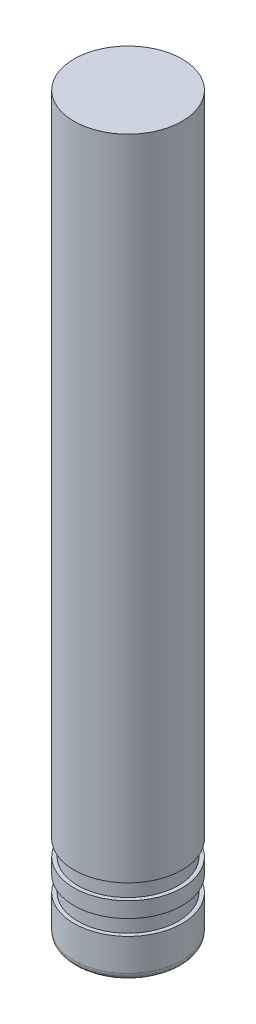
ISO-10303-21;
HEADER;
FILE_DESCRIPTION(('STEP AP214'),'2;1');
FILE_NAME('part.step','',(''),(''),'','','');
FILE_SCHEMA(('AUTOMOTIVE_DESIGN { 1 0 10303 214 1 1 1 1 }'));
ENDSEC;
DATA;
#1=APPLICATION_CONTEXT('core data for automotive mechanical design processes');
#2=APPLICATION_PROTOCOL_DEFINITION('international standard','automotive_design',2000,#1);
#3=PRODUCT_CONTEXT('',#1,'mechanical');
#4=PRODUCT('Part','Part','',(#3));
#5=PRODUCT_RELATED_PRODUCT_CATEGORY('part','',(#4));
#6=PRODUCT_DEFINITION_FORMATION('','',#4);
#7=PRODUCT_DEFINITION_CONTEXT('part definition',#1,'design');
#8=PRODUCT_DEFINITION('design','',#6,#7);
#9=PRODUCT_DEFINITION_SHAPE('','',#8);
#10=(LENGTH_UNIT() NAMED_UNIT(*) SI_UNIT(.MILLI.,.METRE.));
#11=(NAMED_UNIT(*) PLANE_ANGLE_UNIT() SI_UNIT($,.RADIAN.));
#12=(NAMED_UNIT(*) SI_UNIT($,.STERADIAN.) SOLID_ANGLE_UNIT());
#13=UNCERTAINTY_MEASURE_WITH_UNIT(LENGTH_MEASURE(1.E-05),#10,'distance_accuracy_value','');
#14=(GEOMETRIC_REPRESENTATION_CONTEXT(3) GLOBAL_UNCERTAINTY_ASSIGNED_CONTEXT((#13)) GLOBAL_UNIT_ASSIGNED_CONTEXT((#10,
#11,#12)) REPRESENTATION_CONTEXT('',''));
#15=CARTESIAN_POINT('',(0.,0.,0.));
#16=DIRECTION('',(0.,0.,1.));
#17=DIRECTION('',(1.,0.,0.));
#18=AXIS2_PLACEMENT_3D('',#15,#16,#17);
#19=CARTESIAN_POINT('',(20.,0.,7.));
#20=DIRECTION('',(0.,-1.,0.));
#21=DIRECTION('',(-1.,0.,0.));
#22=AXIS2_PLACEMENT_3D('',#19,#20,#21);
#23=PLANE('',#22);
#24=CARTESIAN_POINT('',(20.,0.,7.));
#25=DIRECTION('',(0.,-1.,0.));
#26=DIRECTION('',(1.,0.,0.));
#27=AXIS2_PLACEMENT_3D('',#24,#25,#26);
#28=CIRCLE('',#27,3.5);
#29=CARTESIAN_POINT('',(23.5,0.,7.));
#30=VERTEX_POINT('',#29);
#31=EDGE_CURVE('E27',#30,#30,#28,.T.);
#32=ORIENTED_EDGE('',*,*,#31,.F.);
#33=EDGE_LOOP('',(#32));
#34=FACE_BOUND('',#33,.T.);
#35=ADVANCED_FACE('F17',(#34),#23,.F.);
#36=CARTESIAN_POINT('',(20.,0.,7.));
#37=DIRECTION('',(0.,1.,0.));
#38=DIRECTION('',(1.,0.,0.));
#39=AXIS2_PLACEMENT_3D('',#36,#37,#38);
#40=CYLINDRICAL_SURFACE('',#39,3.5);
#41=ORIENTED_EDGE('',*,*,#31,.T.);
#42=DIRECTION('',(0.,-1.,0.));
#43=VECTOR('',#42,1.);
#44=CARTESIAN_POINT('',(23.5,0.,7.));
#45=LINE('',#44,#43);
#46=CARTESIAN_POINT('',(23.5,-42.,7.));
#47=VERTEX_POINT('',#46);
#48=EDGE_CURVE('E11',#30,#47,#45,.T.);
#49=ORIENTED_EDGE('',*,*,#48,.T.);
#50=CARTESIAN_POINT('',(20.,-42.,7.));
#51=DIRECTION('',(0.,-1.,0.));
#52=DIRECTION('',(1.,0.,0.));
#53=AXIS2_PLACEMENT_3D('',#50,#51,#52);
#54=CIRCLE('',#53,3.5);
#55=EDGE_CURVE('E76',#47,#47,#54,.T.);
#56=ORIENTED_EDGE('',*,*,#55,.F.);
#57=ORIENTED_EDGE('',*,*,#48,.F.);
#58=EDGE_LOOP('',(#41,#49,#56,#57));
#59=FACE_BOUND('',#58,.T.);
#60=ADVANCED_FACE('F225',(#59),#40,.T.);
#61=CARTESIAN_POINT('',(20.,-42.,7.));
#62=DIRECTION('',(0.,-1.,0.));
#63=DIRECTION('',(-1.,0.,0.));
#64=AXIS2_PLACEMENT_3D('',#61,#62,#63);
#65=PLANE('',#64);
#66=CARTESIAN_POINT('',(20.,-42.,7.));
#67=DIRECTION('',(0.,-1.,0.));
#68=DIRECTION('',(1.,0.,0.));
#69=AXIS2_PLACEMENT_3D('',#66,#67,#68);
#70=CIRCLE('',#69,3.25);
#71=CARTESIAN_POINT('',(23.25,-42.,7.));
#72=VERTEX_POINT('',#71);
#73=EDGE_CURVE('E70',#72,#72,#70,.T.);
#74=ORIENTED_EDGE('',*,*,#73,.F.);
#75=EDGE_LOOP('',(#74));
#76=FACE_BOUND('',#75,.T.);
#77=ORIENTED_EDGE('',*,*,#55,.T.);
#78=EDGE_LOOP('',(#77));
#79=FACE_BOUND('',#78,.T.);
#80=ADVANCED_FACE('F136',(#76,#79),#65,.T.);
#81=CARTESIAN_POINT('',(20.,-42.,7.));
#82=DIRECTION('',(0.,1.,0.));
#83=DIRECTION('',(1.,0.,0.));
#84=AXIS2_PLACEMENT_3D('',#81,#82,#83);
#85=CYLINDRICAL_SURFACE('',#84,3.25);
#86=DIRECTION('',(0.,-1.,0.));
#87=VECTOR('',#86,1.);
#88=CARTESIAN_POINT('',(23.25,-42.,7.));
#89=LINE('',#88,#87);
#90=CARTESIAN_POINT('',(23.25,-43.,7.));
#91=VERTEX_POINT('',#90);
#92=EDGE_CURVE('E73',#72,#91,#89,.T.);
#93=ORIENTED_EDGE('',*,*,#92,.T.);
#94=CARTESIAN_POINT('',(20.,-43.,7.));
#95=DIRECTION('',(0.,1.,0.));
#96=DIRECTION('',(1.,0.,0.));
#97=AXIS2_PLACEMENT_3D('',#94,#95,#96);
#98=CIRCLE('',#97,3.25);
#99=EDGE_CURVE('E85',#91,#91,#98,.T.);
#100=ORIENTED_EDGE('',*,*,#99,.T.);
#101=ORIENTED_EDGE('',*,*,#92,.F.);
#102=ORIENTED_EDGE('',*,*,#73,.T.);
#103=EDGE_LOOP('',(#93,#100,#101,#102));
#104=FACE_BOUND('',#103,.T.);
#105=ADVANCED_FACE('F71',(#104),#85,.T.);
#106=CARTESIAN_POINT('',(20.,-43.,7.));
#107=DIRECTION('',(0.,-1.,0.));
#108=DIRECTION('',(-1.,0.,0.));
#109=AXIS2_PLACEMENT_3D('',#106,#107,#108);
#110=PLANE('',#109);
#111=ORIENTED_EDGE('',*,*,#99,.F.);
#112=EDGE_LOOP('',(#111));
#113=FACE_BOUND('',#112,.T.);
#114=CARTESIAN_POINT('',(20.,-43.,7.));
#115=DIRECTION('',(0.,-1.,0.));
#116=DIRECTION('',(1.,0.,0.));
#117=AXIS2_PLACEMENT_3D('',#114,#115,#116);
#118=CIRCLE('',#117,3.5);
#119=CARTESIAN_POINT('',(23.5,-43.,7.));
#120=VERTEX_POINT('',#119);
#121=EDGE_CURVE('E162',#120,#120,#118,.T.);
#122=ORIENTED_EDGE('',*,*,#121,.F.);
#123=EDGE_LOOP('',(#122));
#124=FACE_BOUND('',#123,.T.);
#125=ADVANCED_FACE('F120',(#113,#124),#110,.F.);
#126=CARTESIAN_POINT('',(20.,-43.,7.));
#127=DIRECTION('',(0.,1.,0.));
#128=DIRECTION('',(1.,0.,0.));
#129=AXIS2_PLACEMENT_3D('',#126,#127,#128);
#130=CYLINDRICAL_SURFACE('',#129,3.5);
#131=ORIENTED_EDGE('',*,*,#121,.T.);
#132=DIRECTION('',(0.,-1.,0.));
#133=VECTOR('',#132,1.);
#134=CARTESIAN_POINT('',(23.5,-43.,7.));
#135=LINE('',#134,#133);
#136=CARTESIAN_POINT('',(23.5,-44.,7.));
#137=VERTEX_POINT('',#136);
#138=EDGE_CURVE('E172',#120,#137,#135,.T.);
#139=ORIENTED_EDGE('',*,*,#138,.T.);
#140=CARTESIAN_POINT('',(20.,-44.,7.));
#141=DIRECTION('',(0.,-1.,0.));
#142=DIRECTION('',(1.,0.,0.));
#143=AXIS2_PLACEMENT_3D('',#140,#141,#142);
#144=CIRCLE('',#143,3.5);
#145=EDGE_CURVE('E155',#137,#137,#144,.T.);
#146=ORIENTED_EDGE('',*,*,#145,.F.);
#147=ORIENTED_EDGE('',*,*,#138,.F.);
#148=EDGE_LOOP('',(#131,#139,#146,#147));
#149=FACE_BOUND('',#148,.T.);
#150=ADVANCED_FACE('F128',(#149),#130,.T.);
#151=CARTESIAN_POINT('',(20.,-48.,7.));
#152=DIRECTION('',(0.,-1.,0.));
#153=DIRECTION('',(-1.,0.,0.));
#154=AXIS2_PLACEMENT_3D('',#151,#152,#153);
#155=PLANE('',#154);
#156=CARTESIAN_POINT('',(20.,-48.,7.));
#157=DIRECTION('',(0.,-1.,0.));
#158=DIRECTION('',(1.,0.,0.));
#159=AXIS2_PLACEMENT_3D('',#156,#157,#158);
#160=CIRCLE('',#159,0.458618734851);
#161=CARTESIAN_POINT('',(20.458618734851,-48.,7.));
#162=VERTEX_POINT('',#161);
#163=EDGE_CURVE('E163',#162,#162,#160,.T.);
#164=ORIENTED_EDGE('',*,*,#163,.T.);
#165=EDGE_LOOP('',(#164));
#166=FACE_BOUND('',#165,.T.);
#167=ADVANCED_FACE('F149',(#166),#155,.T.);
#168=CARTESIAN_POINT('',(20.,-44.,7.));
#169=DIRECTION('',(0.,-1.,0.));
#170=DIRECTION('',(-1.,0.,0.));
#171=AXIS2_PLACEMENT_3D('',#168,#169,#170);
#172=PLANE('',#171);
#173=CARTESIAN_POINT('',(20.,-44.,7.));
#174=DIRECTION('',(0.,1.,0.));
#175=DIRECTION('',(1.,0.,0.));
#176=AXIS2_PLACEMENT_3D('',#173,#174,#175);
#177=CIRCLE('',#176,3.25);
#178=CARTESIAN_POINT('',(23.25,-44.,7.));
#179=VERTEX_POINT('',#178);
#180=EDGE_CURVE('E200',#179,#179,#177,.T.);
#181=ORIENTED_EDGE('',*,*,#180,.T.);
#182=EDGE_LOOP('',(#181));
#183=FACE_BOUND('',#182,.T.);
#184=ORIENTED_EDGE('',*,*,#145,.T.);
#185=EDGE_LOOP('',(#184));
#186=FACE_BOUND('',#185,.T.);
#187=ADVANCED_FACE('F118',(#183,#186),#172,.T.);
#188=CARTESIAN_POINT('',(20.540818228504,-47.99319696191,7.));
#189=CARTESIAN_POINT('',(20.513667953182,-47.9977220078,7.));
#190=CARTESIAN_POINT('',(20.48614351442,-48.,7.));
#191=CARTESIAN_POINT('',(20.458618734851,-48.,7.));
#192=(BOUNDED_CURVE() B_SPLINE_CURVE(3,(#188,#189,#190,#191),.UNSPECIFIED.,.F.,
.F.) B_SPLINE_CURVE_WITH_KNOTS((4,4),(1.40564764938,1.570796326795),
.UNSPECIFIED.) CURVE() GEOMETRIC_REPRESENTATION_ITEM() RATIONAL_B_SPLINE_CURVE((1.,1.,1.,1.)) REPRESENTATION_ITEM(''));
#193=CARTESIAN_POINT('',(20.,-47.5,7.));
#194=DIRECTION('',(0.,1.,0.));
#195=AXIS1_PLACEMENT('',#193,#194);
#196=SURFACE_OF_REVOLUTION('',#192,#195);
#197=CARTESIAN_POINT('',(20.458618734851,-47.5,7.));
#198=DIRECTION('',(0.,0.,-1.));
#199=DIRECTION('',(1.,0.,0.));
#200=AXIS2_PLACEMENT_3D('',#197,#198,#199);
#201=CIRCLE('',#200,0.5);
#202=CARTESIAN_POINT('',(20.540818228504,-47.99319696191,7.));
#203=VERTEX_POINT('',#202);
#204=EDGE_CURVE('E176',#203,#162,#201,.T.);
#205=ORIENTED_EDGE('',*,*,#204,.F.);
#206=CARTESIAN_POINT('',(20.,-47.99319696191,7.));
#207=DIRECTION('',(0.,-1.,0.));
#208=DIRECTION('',(1.,0.,0.));
#209=AXIS2_PLACEMENT_3D('',#206,#207,#208);
#210=CIRCLE('',#209,0.540818228504);
#211=EDGE_CURVE('E181',#203,#203,#210,.T.);
#212=ORIENTED_EDGE('',*,*,#211,.T.);
#213=ORIENTED_EDGE('',*,*,#204,.T.);
#214=ORIENTED_EDGE('',*,*,#163,.F.);
#215=EDGE_LOOP('',(#205,#212,#213,#214));
#216=FACE_BOUND('',#215,.T.);
#217=ADVANCED_FACE('F143',(#216),#196,.F.);
#218=CARTESIAN_POINT('',(20.,-42.,7.));
#219=DIRECTION('',(0.,1.,0.));
#220=DIRECTION('',(1.,0.,0.));
#221=AXIS2_PLACEMENT_3D('',#218,#219,#220);
#222=CYLINDRICAL_SURFACE('',#221,3.25);
#223=DIRECTION('',(0.,-1.,0.));
#224=VECTOR('',#223,1.);
#225=CARTESIAN_POINT('',(23.25,-42.,7.));
#226=LINE('',#225,#224);
#227=CARTESIAN_POINT('',(23.25,-45.,7.));
#228=VERTEX_POINT('',#227);
#229=EDGE_CURVE('E196',#179,#228,#226,.T.);
#230=ORIENTED_EDGE('',*,*,#229,.T.);
#231=CARTESIAN_POINT('',(20.,-45.,7.));
#232=DIRECTION('',(0.,-1.,0.));
#233=DIRECTION('',(1.,0.,0.));
#234=AXIS2_PLACEMENT_3D('',#231,#232,#233);
#235=CIRCLE('',#234,3.25);
#236=EDGE_CURVE('E182',#228,#228,#235,.T.);
#237=ORIENTED_EDGE('',*,*,#236,.F.);
#238=ORIENTED_EDGE('',*,*,#229,.F.);
#239=ORIENTED_EDGE('',*,*,#180,.F.);
#240=EDGE_LOOP('',(#230,#237,#238,#239));
#241=FACE_BOUND('',#240,.T.);
#242=ADVANCED_FACE('F139',(#241),#222,.T.);
#243=CARTESIAN_POINT('',(20.,-47.5,7.));
#244=DIRECTION('',(0.,1.,0.));
#245=DIRECTION('',(1.,0.,0.));
#246=AXIS2_PLACEMENT_3D('',#243,#244,#245);
#247=CONICAL_SURFACE('',#246,3.5,1.40564764938);
#248=DIRECTION('',(-0.986393923832198,-0.164398987305033,0.));
#249=VECTOR('',#248,1.);
#250=CARTESIAN_POINT('',(23.5,-47.5,7.));
#251=LINE('',#250,#249);
#252=CARTESIAN_POINT('',(23.082199493653,-47.56963341772,7.));
#253=VERTEX_POINT('',#252);
#254=EDGE_CURVE('E177',#253,#203,#251,.T.);
#255=ORIENTED_EDGE('',*,*,#254,.F.);
#256=CARTESIAN_POINT('',(23.082199493653,-47.56963341772,7.));
#257=CARTESIAN_POINT('',(23.082199493653,-47.56963341772,8.468145178085));
#258=CARTESIAN_POINT('',(22.323413626485,-47.56963341772,9.970146890355));
#259=CARTESIAN_POINT('',(20.761938560407,-47.56963341772,11.044142022432));
#260=CARTESIAN_POINT('',(18.613150670872,-47.56963341772,11.209087206813));
#261=CARTESIAN_POINT('',(16.756853696144,-47.56963341772,10.064378402385));
#262=CARTESIAN_POINT('',(15.395454860038,-47.56963341771,8.393359286212));
#263=CARTESIAN_POINT('',(15.395454860019,-47.56963341773,5.606640713777));
#264=CARTESIAN_POINT('',(16.756853696151,-47.56963341772,3.935621597635));
#265=CARTESIAN_POINT('',(18.613150670876,-47.56963341772,2.79091279317));
#266=CARTESIAN_POINT('',(20.7619385604,-47.56963341772,2.955857977577));
#267=CARTESIAN_POINT('',(22.323413626489,-47.56963341772,4.029853109643));
#268=CARTESIAN_POINT('',(23.082199493652,-47.56963341772,5.531854821915));
#269=CARTESIAN_POINT('',(23.082199493653,-47.56963341772,7.));
#270=(BOUNDED_CURVE() B_SPLINE_CURVE(13,(#256,#257,#258,#259,#260,#261,#262,#263,#264,#265,#266,
#267,#268,#269),.UNSPECIFIED.,.T.,.F.) B_SPLINE_CURVE_WITH_KNOTS((14,14),(0.,21.991148575129),
.UNSPECIFIED.) CURVE() GEOMETRIC_REPRESENTATION_ITEM() RATIONAL_B_SPLINE_CURVE((1.,1.,1.,1.,1.,
1.,1.,1.,1.,1.,1.,1.,1.,1.)) REPRESENTATION_ITEM(''));
#271=EDGE_CURVE('E183',#253,#253,#270,.T.);
#272=ORIENTED_EDGE('',*,*,#271,.T.);
#273=ORIENTED_EDGE('',*,*,#254,.T.);
#274=ORIENTED_EDGE('',*,*,#211,.F.);
#275=EDGE_LOOP('',(#255,#272,#273,#274));
#276=FACE_BOUND('',#275,.T.);
#277=ADVANCED_FACE('F132',(#276),#247,.T.);
#278=CARTESIAN_POINT('',(20.,-45.,7.));
#279=DIRECTION('',(0.,-1.,0.));
#280=DIRECTION('',(-1.,0.,0.));
#281=AXIS2_PLACEMENT_3D('',#278,#279,#280);
#282=PLANE('',#281);
#283=ORIENTED_EDGE('',*,*,#236,.T.);
#284=EDGE_LOOP('',(#283));
#285=FACE_BOUND('',#284,.T.);
#286=CARTESIAN_POINT('',(20.,-45.,7.));
#287=DIRECTION('',(0.,-1.,0.));
#288=DIRECTION('',(1.,0.,0.));
#289=AXIS2_PLACEMENT_3D('',#286,#287,#288);
#290=CIRCLE('',#289,3.5);
#291=CARTESIAN_POINT('',(23.5,-45.,7.));
#292=VERTEX_POINT('',#291);
#293=EDGE_CURVE('E164',#292,#292,#290,.T.);
#294=ORIENTED_EDGE('',*,*,#293,.F.);
#295=EDGE_LOOP('',(#294));
#296=FACE_BOUND('',#295,.T.);
#297=ADVANCED_FACE('F117',(#285,#296),#282,.F.);
#298=CARTESIAN_POINT('',(23.5,-47.0764364558,7.));
#299=CARTESIAN_POINT('',(23.500000000001,-47.0764364558,8.66715624147));
#300=CARTESIAN_POINT('',(22.63835864922,-47.0764364558,10.372758362219));
#301=CARTESIAN_POINT('',(20.865221400142,-47.0764364558,11.592336449234));
#302=CARTESIAN_POINT('',(18.425159480455,-47.0764364558,11.779640401013));
#303=CARTESIAN_POINT('',(16.317236412857,-47.0764364558,10.479763211447));
#304=CARTESIAN_POINT('',(14.771296269757,-47.0764364558,8.582232918983));
#305=CARTESIAN_POINT('',(14.771296269702,-47.07643645581,5.417767081005));
#306=CARTESIAN_POINT('',(16.317236412889,-47.0764364558,3.520236788574));
#307=CARTESIAN_POINT('',(18.425159480445,-47.07643645581,2.220359598968));
#308=CARTESIAN_POINT('',(20.86522140014,-47.0764364558,2.407663550775));
#309=CARTESIAN_POINT('',(22.638358649222,-47.0764364558,3.627241637779));
#310=CARTESIAN_POINT('',(23.5,-47.0764364558,5.33284375853));
#311=CARTESIAN_POINT('',(23.5,-47.0764364558,7.));
#312=CARTESIAN_POINT('',(23.5,-47.5,7.));
#313=CARTESIAN_POINT('',(23.500000000001,-47.5,8.66715624147));
#314=CARTESIAN_POINT('',(22.63835864922,-47.5,10.37275836222));
#315=CARTESIAN_POINT('',(20.865221400145,-47.5,11.592336449229));
#316=CARTESIAN_POINT('',(18.425159480442,-47.49999999999,11.779640401022));
#317=CARTESIAN_POINT('',(16.317236412886,-47.5,10.479763211438));
#318=CARTESIAN_POINT('',(14.771296269715,-47.49999999999,8.58223291898701));
#319=CARTESIAN_POINT('',(14.771296269742,-47.5,5.417767081011));
#320=CARTESIAN_POINT('',(16.317236412862,-47.49999999999,3.520236788565));
#321=CARTESIAN_POINT('',(18.425159480458,-47.5,2.220359598977));
#322=CARTESIAN_POINT('',(20.865221400136,-47.5,2.407663550771));
#323=CARTESIAN_POINT('',(22.638358649223,-47.5,3.62724163778));
#324=CARTESIAN_POINT('',(23.5,-47.5,5.33284375853));
#325=CARTESIAN_POINT('',(23.5,-47.5,7.));
#326=CARTESIAN_POINT('',(23.082199493653,-47.56963341772,7.));
#327=CARTESIAN_POINT('',(23.082199493653,-47.56963341772,8.468145178085));
#328=CARTESIAN_POINT('',(22.323413626485,-47.56963341772,9.970146890355));
#329=CARTESIAN_POINT('',(20.761938560407,-47.56963341772,11.044142022432));
#330=CARTESIAN_POINT('',(18.613150670872,-47.56963341772,11.209087206813));
#331=CARTESIAN_POINT('',(16.756853696144,-47.56963341772,10.064378402385));
#332=CARTESIAN_POINT('',(15.395454860038,-47.56963341771,8.393359286212));
#333=CARTESIAN_POINT('',(15.395454860019,-47.56963341773,5.606640713777));
#334=CARTESIAN_POINT('',(16.756853696151,-47.56963341772,3.935621597635));
#335=CARTESIAN_POINT('',(18.613150670876,-47.56963341772,2.79091279317));
#336=CARTESIAN_POINT('',(20.7619385604,-47.56963341772,2.955857977577));
#337=CARTESIAN_POINT('',(22.323413626489,-47.56963341772,4.029853109643));
#338=CARTESIAN_POINT('',(23.082199493652,-47.56963341772,5.531854821915));
#339=CARTESIAN_POINT('',(23.082199493653,-47.56963341772,7.));
#340=(BOUNDED_SURFACE() B_SPLINE_SURFACE(2,13,((#298,#299,#300,#301,#302,#303,#304,#305,#306,
#307,#308,#309,#310,#311),(#312,#313,#314,#315,#316,#317,#318,#319,#320,#321,#322,#323,#324,
#325),(#326,#327,#328,#329,#330,#331,#332,#333,#334,#335,#336,#337,#338,#339)),.UNSPECIFIED.,
.F.,.T.,.F.) B_SPLINE_SURFACE_WITH_KNOTS((3,3),(14,14),(0.,21.991148575129),(0.,
21.991148575129),.UNSPECIFIED.) GEOMETRIC_REPRESENTATION_ITEM() RATIONAL_B_SPLINE_SURFACE(((1.,
1.,1.000000000001,0.999999999999,1.000000000003,0.999999999996,1.000000000005,0.999999999996,
1.000000000003,0.999999999998,1.000000000001,1.,1.,1.),(0.763019982473,0.763019982473,
0.763019982473,0.763019982473,0.763019982473,0.763019982472,0.763019982474,0.763019982472,
0.763019982473,0.763019982473,0.763019982473,0.763019982473,0.763019982473,0.763019982473),(1.,
1.,1.000000000001,0.999999999999,1.000000000003,0.999999999996,1.000000000005,0.999999999996,
1.000000000003,0.999999999998,1.000000000001,1.,1.,1.))) REPRESENTATION_ITEM('') SURFACE());
#341=CARTESIAN_POINT('',(23.5,-47.0764364558,7.));
#342=CARTESIAN_POINT('',(23.500000000001,-47.0764364558,8.66715624147));
#343=CARTESIAN_POINT('',(22.63835864922,-47.0764364558,10.372758362219));
#344=CARTESIAN_POINT('',(20.865221400142,-47.0764364558,11.592336449234));
#345=CARTESIAN_POINT('',(18.425159480455,-47.0764364558,11.779640401013));
#346=CARTESIAN_POINT('',(16.317236412857,-47.0764364558,10.479763211447));
#347=CARTESIAN_POINT('',(14.771296269757,-47.0764364558,8.582232918983));
#348=CARTESIAN_POINT('',(14.771296269702,-47.07643645581,5.417767081005));
#349=CARTESIAN_POINT('',(16.317236412889,-47.0764364558,3.520236788574));
#350=CARTESIAN_POINT('',(18.425159480445,-47.07643645581,2.220359598968));
#351=CARTESIAN_POINT('',(20.86522140014,-47.0764364558,2.407663550775));
#352=CARTESIAN_POINT('',(22.638358649222,-47.0764364558,3.627241637779));
#353=CARTESIAN_POINT('',(23.5,-47.0764364558,5.33284375853));
#354=CARTESIAN_POINT('',(23.5,-47.0764364558,7.));
#355=(BOUNDED_CURVE() B_SPLINE_CURVE(13,(#341,#342,#343,#344,#345,#346,#347,#348,#349,#350,#351,
#352,#353,#354),.UNSPECIFIED.,.T.,.F.) B_SPLINE_CURVE_WITH_KNOTS((14,14),(0.,21.991148575129),
.UNSPECIFIED.) CURVE() GEOMETRIC_REPRESENTATION_ITEM() RATIONAL_B_SPLINE_CURVE((1.,1.,
1.000000000001,0.999999999999,1.000000000003,0.999999999996,1.000000000005,0.999999999996,
1.000000000003,0.999999999998,1.000000000001,1.,1.,1.)) REPRESENTATION_ITEM(''));
#356=CARTESIAN_POINT('',(23.5,-47.0764364558,7.));
#357=VERTEX_POINT('',#356);
#358=EDGE_CURVE('E98',#357,#357,#355,.T.);
#359=CARTESIAN_POINT('',(23.5,-47.0764364558,7.));
#360=CARTESIAN_POINT('',(23.5,-47.5,7.));
#361=CARTESIAN_POINT('',(23.082199493653,-47.56963341772,7.));
#362=(BOUNDED_CURVE() B_SPLINE_CURVE(2,(#359,#360,#361),.UNSPECIFIED.,.F.,
.F.) B_SPLINE_CURVE_WITH_KNOTS((3,3),(0.,21.991148575129),
.UNSPECIFIED.) CURVE() GEOMETRIC_REPRESENTATION_ITEM() RATIONAL_B_SPLINE_CURVE((1.,
0.763019982473,1.)) REPRESENTATION_ITEM(''));
#363=EDGE_CURVE('E189',#357,#253,#362,.T.);
#364=ORIENTED_EDGE('',*,*,#358,.T.);
#365=ORIENTED_EDGE('',*,*,#363,.T.);
#366=ORIENTED_EDGE('',*,*,#271,.F.);
#367=ORIENTED_EDGE('',*,*,#363,.F.);
#368=EDGE_LOOP('',(#364,#365,#366,#367));
#369=FACE_BOUND('',#368,.T.);
#370=ADVANCED_FACE('F104',(#369),#340,.F.);
#371=CARTESIAN_POINT('',(20.,-45.,7.));
#372=DIRECTION('',(0.,1.,0.));
#373=DIRECTION('',(1.,0.,0.));
#374=AXIS2_PLACEMENT_3D('',#371,#372,#373);
#375=CYLINDRICAL_SURFACE('',#374,3.5);
#376=ORIENTED_EDGE('',*,*,#293,.T.);
#377=DIRECTION('',(0.,-1.,0.));
#378=VECTOR('',#377,1.);
#379=CARTESIAN_POINT('',(23.5,-45.,7.));
#380=LINE('',#379,#378);
#381=EDGE_CURVE('E168',#292,#357,#380,.T.);
#382=ORIENTED_EDGE('',*,*,#381,.T.);
#383=ORIENTED_EDGE('',*,*,#358,.F.);
#384=ORIENTED_EDGE('',*,*,#381,.F.);
#385=EDGE_LOOP('',(#376,#382,#383,#384));
#386=FACE_BOUND('',#385,.T.);
#387=ADVANCED_FACE('F116',(#386),#375,.T.);
#388=CLOSED_SHELL('',(#35,#60,#80,#105,#125,#150,#167,#187,#217,#242,#277,#297,#370,#387));
#389=MANIFOLD_SOLID_BREP('B1',#388);
#390=ADVANCED_BREP_SHAPE_REPRESENTATION('',(#18,#389),#14);
#391=SHAPE_DEFINITION_REPRESENTATION(#9,#390);
ENDSEC;
END-ISO-10303-21;
